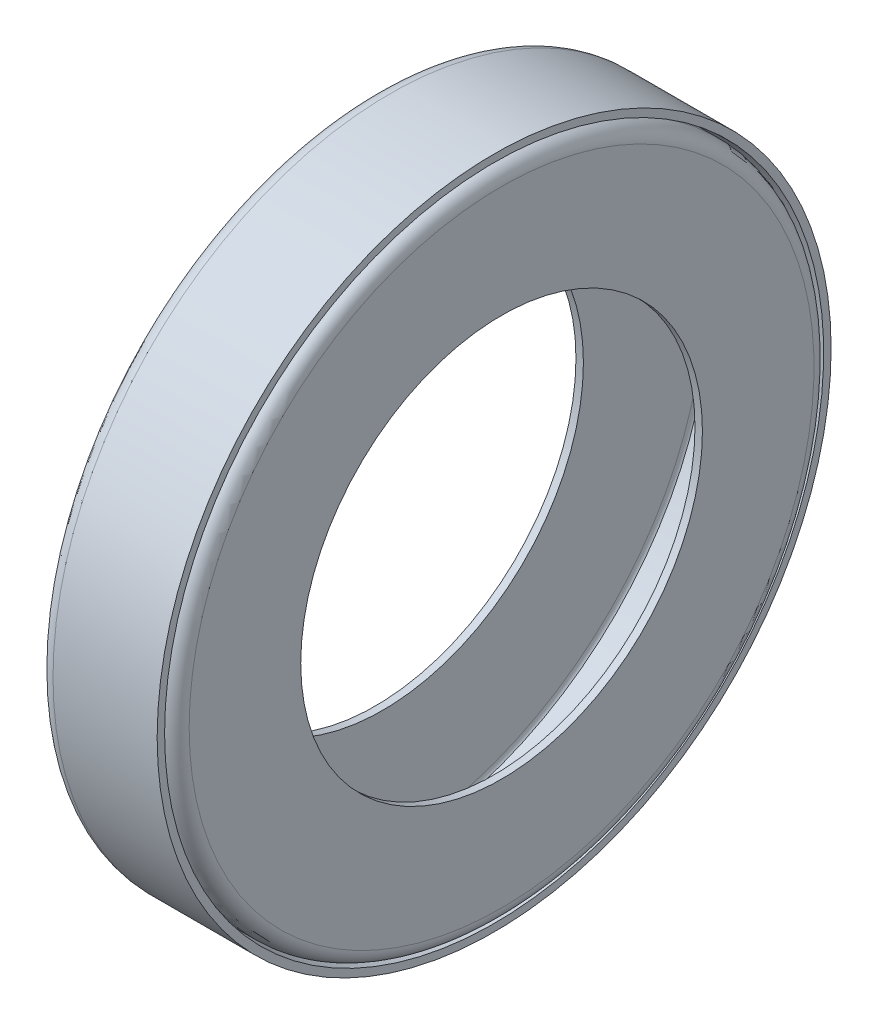
ISO-10303-21;
HEADER;
FILE_DESCRIPTION(('STEP AP214'),'2;1');
FILE_NAME('part.step','',(''),(''),'','','');
FILE_SCHEMA(('AUTOMOTIVE_DESIGN { 1 0 10303 214 1 1 1 1 }'));
ENDSEC;
DATA;
#1=APPLICATION_CONTEXT('core data for automotive mechanical design processes');
#2=APPLICATION_PROTOCOL_DEFINITION('international standard','automotive_design',2000,#1);
#3=PRODUCT_CONTEXT('',#1,'mechanical');
#4=PRODUCT('Part','Part','',(#3));
#5=PRODUCT_RELATED_PRODUCT_CATEGORY('part','',(#4));
#6=PRODUCT_DEFINITION_FORMATION('','',#4);
#7=PRODUCT_DEFINITION_CONTEXT('part definition',#1,'design');
#8=PRODUCT_DEFINITION('design','',#6,#7);
#9=PRODUCT_DEFINITION_SHAPE('','',#8);
#10=(LENGTH_UNIT() NAMED_UNIT(*) SI_UNIT(.MILLI.,.METRE.));
#11=(NAMED_UNIT(*) PLANE_ANGLE_UNIT() SI_UNIT($,.RADIAN.));
#12=(NAMED_UNIT(*) SI_UNIT($,.STERADIAN.) SOLID_ANGLE_UNIT());
#13=UNCERTAINTY_MEASURE_WITH_UNIT(LENGTH_MEASURE(1.E-05),#10,'distance_accuracy_value','');
#14=(GEOMETRIC_REPRESENTATION_CONTEXT(3) GLOBAL_UNCERTAINTY_ASSIGNED_CONTEXT((#13)) GLOBAL_UNIT_ASSIGNED_CONTEXT((#10,
#11,#12)) REPRESENTATION_CONTEXT('',''));
#15=CARTESIAN_POINT('',(0.,0.,0.));
#16=DIRECTION('',(0.,0.,1.));
#17=DIRECTION('',(1.,0.,0.));
#18=AXIS2_PLACEMENT_3D('',#15,#16,#17);
#19=CARTESIAN_POINT('',(-12.2552186006477,0.,0.));
#20=DIRECTION('',(-1.,0.,0.));
#21=DIRECTION('',(0.,0.,1.));
#22=AXIS2_PLACEMENT_3D('',#19,#20,#21);
#23=CYLINDRICAL_SURFACE('',#22,27.);
#24=CARTESIAN_POINT('',(17.,0.,0.));
#25=DIRECTION('',(-1.,0.,0.));
#26=DIRECTION('',(0.,0.,1.));
#27=AXIS2_PLACEMENT_3D('',#24,#25,#26);
#28=CIRCLE('',#27,27.);
#29=CARTESIAN_POINT('',(17.,0.,27.));
#30=VERTEX_POINT('',#29);
#31=EDGE_CURVE('E59',#30,#30,#28,.T.);
#32=ORIENTED_EDGE('',*,*,#31,.F.);
#33=EDGE_LOOP('',(#32));
#34=FACE_BOUND('',#33,.T.);
#35=CARTESIAN_POINT('',(16.,0.,0.));
#36=DIRECTION('',(-1.,0.,0.));
#37=DIRECTION('',(0.,0.,1.));
#38=AXIS2_PLACEMENT_3D('',#35,#36,#37);
#39=CIRCLE('',#38,27.);
#40=CARTESIAN_POINT('',(16.,0.,27.));
#41=VERTEX_POINT('',#40);
#42=EDGE_CURVE('E68',#41,#41,#39,.T.);
#43=ORIENTED_EDGE('',*,*,#42,.T.);
#44=EDGE_LOOP('',(#43));
#45=FACE_BOUND('',#44,.T.);
#46=ADVANCED_FACE('F39',(#34,#45),#23,.F.);
#47=CARTESIAN_POINT('',(17.,27.,0.));
#48=DIRECTION('',(-1.,0.,0.));
#49=DIRECTION('',(0.,0.,1.));
#50=AXIS2_PLACEMENT_3D('',#47,#48,#49);
#51=PLANE('',#50);
#52=CARTESIAN_POINT('',(17.,0.,0.));
#53=DIRECTION('',(-1.,0.,0.));
#54=DIRECTION('',(0.,0.,1.));
#55=AXIS2_PLACEMENT_3D('',#52,#53,#54);
#56=CIRCLE('',#55,42.);
#57=CARTESIAN_POINT('',(17.,0.,42.));
#58=VERTEX_POINT('',#57);
#59=EDGE_CURVE('E11',#58,#58,#56,.F.);
#60=ORIENTED_EDGE('',*,*,#59,.T.);
#61=EDGE_LOOP('',(#60));
#62=FACE_BOUND('',#61,.T.);
#63=ORIENTED_EDGE('',*,*,#31,.T.);
#64=EDGE_LOOP('',(#63));
#65=FACE_BOUND('',#64,.T.);
#66=ADVANCED_FACE('F88',(#62,#65),#51,.F.);
#67=CARTESIAN_POINT('',(-12.2552186006477,0.,0.));
#68=DIRECTION('',(-1.,0.,0.));
#69=DIRECTION('',(0.,0.,1.));
#70=AXIS2_PLACEMENT_3D('',#67,#68,#69);
#71=CYLINDRICAL_SURFACE('',#70,44.);
#72=CARTESIAN_POINT('',(15.,0.,0.));
#73=DIRECTION('',(-1.,0.,0.));
#74=DIRECTION('',(0.,0.,1.));
#75=AXIS2_PLACEMENT_3D('',#72,#73,#74);
#76=CIRCLE('',#75,44.);
#77=CARTESIAN_POINT('',(15.,0.,44.));
#78=VERTEX_POINT('',#77);
#79=EDGE_CURVE('E46',#78,#78,#76,.T.);
#80=ORIENTED_EDGE('',*,*,#79,.T.);
#81=EDGE_LOOP('',(#80));
#82=FACE_BOUND('',#81,.T.);
#83=CARTESIAN_POINT('',(2.,0.,0.));
#84=DIRECTION('',(-1.,0.,0.));
#85=DIRECTION('',(0.,0.,1.));
#86=AXIS2_PLACEMENT_3D('',#83,#84,#85);
#87=CIRCLE('',#86,44.);
#88=CARTESIAN_POINT('',(2.,0.,44.));
#89=VERTEX_POINT('',#88);
#90=EDGE_CURVE('E62',#89,#89,#87,.T.);
#91=ORIENTED_EDGE('',*,*,#90,.F.);
#92=EDGE_LOOP('',(#91));
#93=FACE_BOUND('',#92,.T.);
#94=ADVANCED_FACE('F94',(#82,#93),#71,.T.);
#95=CARTESIAN_POINT('',(2.,44.,0.));
#96=DIRECTION('',(1.,0.,0.));
#97=DIRECTION('',(0.,0.,-1.));
#98=AXIS2_PLACEMENT_3D('',#95,#96,#97);
#99=PLANE('',#98);
#100=CARTESIAN_POINT('',(2.,0.,0.));
#101=DIRECTION('',(-1.,0.,0.));
#102=DIRECTION('',(0.,0.,1.));
#103=AXIS2_PLACEMENT_3D('',#100,#101,#102);
#104=CIRCLE('',#103,43.);
#105=CARTESIAN_POINT('',(2.,0.,43.));
#106=VERTEX_POINT('',#105);
#107=EDGE_CURVE('E65',#106,#106,#104,.T.);
#108=ORIENTED_EDGE('',*,*,#107,.F.);
#109=EDGE_LOOP('',(#108));
#110=FACE_BOUND('',#109,.T.);
#111=ORIENTED_EDGE('',*,*,#90,.T.);
#112=EDGE_LOOP('',(#111));
#113=FACE_BOUND('',#112,.T.);
#114=ADVANCED_FACE('F84',(#110,#113),#99,.F.);
#115=CARTESIAN_POINT('',(-12.2552186006477,0.,0.));
#116=DIRECTION('',(-1.,0.,0.));
#117=DIRECTION('',(0.,0.,1.));
#118=AXIS2_PLACEMENT_3D('',#115,#116,#117);
#119=CYLINDRICAL_SURFACE('',#118,43.);
#120=CARTESIAN_POINT('',(15.,0.,0.));
#121=DIRECTION('',(1.,0.,0.));
#122=DIRECTION('',(0.,0.,-1.));
#123=AXIS2_PLACEMENT_3D('',#120,#121,#122);
#124=CIRCLE('',#123,43.);
#125=CARTESIAN_POINT('',(15.,0.,-43.));
#126=VERTEX_POINT('',#125);
#127=EDGE_CURVE('E50',#126,#126,#124,.T.);
#128=ORIENTED_EDGE('',*,*,#127,.T.);
#129=EDGE_LOOP('',(#128));
#130=FACE_BOUND('',#129,.T.);
#131=ORIENTED_EDGE('',*,*,#107,.T.);
#132=EDGE_LOOP('',(#131));
#133=FACE_BOUND('',#132,.T.);
#134=ADVANCED_FACE('F76',(#130,#133),#119,.F.);
#135=CARTESIAN_POINT('',(16.,43.,0.));
#136=DIRECTION('',(1.,0.,0.));
#137=DIRECTION('',(0.,0.,-1.));
#138=AXIS2_PLACEMENT_3D('',#135,#136,#137);
#139=PLANE('',#138);
#140=CARTESIAN_POINT('',(16.,0.,0.));
#141=DIRECTION('',(1.,0.,0.));
#142=DIRECTION('',(0.,0.,-1.));
#143=AXIS2_PLACEMENT_3D('',#140,#141,#142);
#144=CIRCLE('',#143,42.);
#145=CARTESIAN_POINT('',(16.,0.,-42.));
#146=VERTEX_POINT('',#145);
#147=EDGE_CURVE('E54',#146,#146,#144,.F.);
#148=ORIENTED_EDGE('',*,*,#147,.T.);
#149=EDGE_LOOP('',(#148));
#150=FACE_BOUND('',#149,.T.);
#151=ORIENTED_EDGE('',*,*,#42,.F.);
#152=EDGE_LOOP('',(#151));
#153=FACE_BOUND('',#152,.T.);
#154=ADVANCED_FACE('F73',(#150,#153),#139,.F.);
#155=CARTESIAN_POINT('',(15.,0.,0.));
#156=DIRECTION('',(1.,0.,0.));
#157=DIRECTION('',(0.,0.,-1.));
#158=AXIS2_PLACEMENT_3D('',#155,#156,#157);
#159=TOROIDAL_SURFACE('',#158,42.,1.);
#160=ORIENTED_EDGE('',*,*,#127,.F.);
#161=EDGE_LOOP('',(#160));
#162=FACE_BOUND('',#161,.T.);
#163=ORIENTED_EDGE('',*,*,#147,.F.);
#164=EDGE_LOOP('',(#163));
#165=FACE_BOUND('',#164,.T.);
#166=ADVANCED_FACE('F75',(#162,#165),#159,.F.);
#167=CARTESIAN_POINT('',(15.,0.,0.));
#168=DIRECTION('',(-1.,0.,0.));
#169=DIRECTION('',(0.,0.,1.));
#170=AXIS2_PLACEMENT_3D('',#167,#168,#169);
#171=TOROIDAL_SURFACE('',#170,42.,2.);
#172=ORIENTED_EDGE('',*,*,#59,.F.);
#173=EDGE_LOOP('',(#172));
#174=FACE_BOUND('',#173,.T.);
#175=ORIENTED_EDGE('',*,*,#79,.F.);
#176=EDGE_LOOP('',(#175));
#177=FACE_BOUND('',#176,.T.);
#178=ADVANCED_FACE('F41',(#174,#177),#171,.T.);
#179=CLOSED_SHELL('',(#46,#66,#94,#114,#134,#154,#166,#178));
#180=MANIFOLD_SOLID_BREP('B2',#179);
#181=CARTESIAN_POINT('',(-12.2552186006477,0.,0.));
#182=DIRECTION('',(-1.,0.,0.));
#183=DIRECTION('',(0.,0.,1.));
#184=AXIS2_PLACEMENT_3D('',#181,#182,#183);
#185=CYLINDRICAL_SURFACE('',#184,27.);
#186=CARTESIAN_POINT('',(1.,0.,0.));
#187=DIRECTION('',(-1.,0.,0.));
#188=DIRECTION('',(0.,0.,1.));
#189=AXIS2_PLACEMENT_3D('',#186,#187,#188);
#190=CIRCLE('',#189,27.);
#191=CARTESIAN_POINT('',(1.,0.,27.));
#192=VERTEX_POINT('',#191);
#193=EDGE_CURVE('E190',#192,#192,#190,.T.);
#194=ORIENTED_EDGE('',*,*,#193,.F.);
#195=EDGE_LOOP('',(#194));
#196=FACE_BOUND('',#195,.T.);
#197=CARTESIAN_POINT('',(0.,0.,0.));
#198=DIRECTION('',(-1.,0.,0.));
#199=DIRECTION('',(0.,0.,1.));
#200=AXIS2_PLACEMENT_3D('',#197,#198,#199);
#201=CIRCLE('',#200,27.);
#202=CARTESIAN_POINT('',(0.,0.,27.));
#203=VERTEX_POINT('',#202);
#204=EDGE_CURVE('E181',#203,#203,#201,.T.);
#205=ORIENTED_EDGE('',*,*,#204,.T.);
#206=EDGE_LOOP('',(#205));
#207=FACE_BOUND('',#206,.T.);
#208=ADVANCED_FACE('F161',(#196,#207),#185,.F.);
#209=CARTESIAN_POINT('',(0.,27.,0.));
#210=DIRECTION('',(1.,0.,0.));
#211=DIRECTION('',(0.,0.,-1.));
#212=AXIS2_PLACEMENT_3D('',#209,#210,#211);
#213=PLANE('',#212);
#214=CARTESIAN_POINT('',(0.,0.,0.));
#215=DIRECTION('',(1.,0.,0.));
#216=DIRECTION('',(0.,0.,-1.));
#217=AXIS2_PLACEMENT_3D('',#214,#215,#216);
#218=CIRCLE('',#217,43.3);
#219=CARTESIAN_POINT('',(0.,0.,-43.3));
#220=VERTEX_POINT('',#219);
#221=EDGE_CURVE('E168',#220,#220,#218,.F.);
#222=ORIENTED_EDGE('',*,*,#221,.T.);
#223=EDGE_LOOP('',(#222));
#224=FACE_BOUND('',#223,.T.);
#225=ORIENTED_EDGE('',*,*,#204,.F.);
#226=EDGE_LOOP('',(#225));
#227=FACE_BOUND('',#226,.T.);
#228=ADVANCED_FACE('F198',(#224,#227),#213,.F.);
#229=CARTESIAN_POINT('',(-12.2552186006477,0.,0.));
#230=DIRECTION('',(-1.,0.,0.));
#231=DIRECTION('',(0.,0.,1.));
#232=AXIS2_PLACEMENT_3D('',#229,#230,#231);
#233=CYLINDRICAL_SURFACE('',#232,45.3);
#234=CARTESIAN_POINT('',(2.,0.,0.));
#235=DIRECTION('',(1.,0.,0.));
#236=DIRECTION('',(0.,0.,-1.));
#237=AXIS2_PLACEMENT_3D('',#234,#235,#236);
#238=CIRCLE('',#237,45.3);
#239=CARTESIAN_POINT('',(2.,0.,-45.3));
#240=VERTEX_POINT('',#239);
#241=EDGE_CURVE('E38',#240,#240,#238,.T.);
#242=ORIENTED_EDGE('',*,*,#241,.T.);
#243=EDGE_LOOP('',(#242));
#244=FACE_BOUND('',#243,.T.);
#245=CARTESIAN_POINT('',(16.,0.,0.));
#246=DIRECTION('',(-1.,0.,0.));
#247=DIRECTION('',(0.,0.,1.));
#248=AXIS2_PLACEMENT_3D('',#245,#246,#247);
#249=CIRCLE('',#248,45.3);
#250=CARTESIAN_POINT('',(16.,0.,45.3));
#251=VERTEX_POINT('',#250);
#252=EDGE_CURVE('E184',#251,#251,#249,.T.);
#253=ORIENTED_EDGE('',*,*,#252,.T.);
#254=EDGE_LOOP('',(#253));
#255=FACE_BOUND('',#254,.T.);
#256=ADVANCED_FACE('F203',(#244,#255),#233,.T.);
#257=CARTESIAN_POINT('',(16.,45.3,0.));
#258=DIRECTION('',(-1.,0.,0.));
#259=DIRECTION('',(0.,0.,1.));
#260=AXIS2_PLACEMENT_3D('',#257,#258,#259);
#261=PLANE('',#260);
#262=ORIENTED_EDGE('',*,*,#252,.F.);
#263=EDGE_LOOP('',(#262));
#264=FACE_BOUND('',#263,.T.);
#265=CARTESIAN_POINT('',(16.,0.,0.));
#266=DIRECTION('',(-1.,0.,0.));
#267=DIRECTION('',(0.,0.,1.));
#268=AXIS2_PLACEMENT_3D('',#265,#266,#267);
#269=CIRCLE('',#268,44.3);
#270=CARTESIAN_POINT('',(16.,0.,44.3));
#271=VERTEX_POINT('',#270);
#272=EDGE_CURVE('E187',#271,#271,#269,.T.);
#273=ORIENTED_EDGE('',*,*,#272,.T.);
#274=EDGE_LOOP('',(#273));
#275=FACE_BOUND('',#274,.T.);
#276=ADVANCED_FACE('F208',(#264,#275),#261,.F.);
#277=CARTESIAN_POINT('',(-12.2552186006477,0.,0.));
#278=DIRECTION('',(-1.,0.,0.));
#279=DIRECTION('',(0.,0.,1.));
#280=AXIS2_PLACEMENT_3D('',#277,#278,#279);
#281=CYLINDRICAL_SURFACE('',#280,44.3);
#282=CARTESIAN_POINT('',(2.,0.,0.));
#283=DIRECTION('',(-1.,0.,0.));
#284=DIRECTION('',(0.,0.,1.));
#285=AXIS2_PLACEMENT_3D('',#282,#283,#284);
#286=CIRCLE('',#285,44.3);
#287=CARTESIAN_POINT('',(2.,0.,44.3));
#288=VERTEX_POINT('',#287);
#289=EDGE_CURVE('E176',#288,#288,#286,.T.);
#290=ORIENTED_EDGE('',*,*,#289,.T.);
#291=EDGE_LOOP('',(#290));
#292=FACE_BOUND('',#291,.T.);
#293=ORIENTED_EDGE('',*,*,#272,.F.);
#294=EDGE_LOOP('',(#293));
#295=FACE_BOUND('',#294,.T.);
#296=ADVANCED_FACE('F219',(#292,#295),#281,.F.);
#297=CARTESIAN_POINT('',(1.,44.3,0.));
#298=DIRECTION('',(-1.,0.,0.));
#299=DIRECTION('',(0.,0.,1.));
#300=AXIS2_PLACEMENT_3D('',#297,#298,#299);
#301=PLANE('',#300);
#302=CARTESIAN_POINT('',(1.,0.,0.));
#303=DIRECTION('',(-1.,0.,0.));
#304=DIRECTION('',(0.,0.,1.));
#305=AXIS2_PLACEMENT_3D('',#302,#303,#304);
#306=CIRCLE('',#305,43.3);
#307=CARTESIAN_POINT('',(1.,0.,43.3));
#308=VERTEX_POINT('',#307);
#309=EDGE_CURVE('E172',#308,#308,#306,.F.);
#310=ORIENTED_EDGE('',*,*,#309,.T.);
#311=EDGE_LOOP('',(#310));
#312=FACE_BOUND('',#311,.T.);
#313=ORIENTED_EDGE('',*,*,#193,.T.);
#314=EDGE_LOOP('',(#313));
#315=FACE_BOUND('',#314,.T.);
#316=ADVANCED_FACE('F194',(#312,#315),#301,.F.);
#317=CARTESIAN_POINT('',(2.,0.,0.));
#318=DIRECTION('',(-1.,0.,0.));
#319=DIRECTION('',(0.,0.,1.));
#320=AXIS2_PLACEMENT_3D('',#317,#318,#319);
#321=TOROIDAL_SURFACE('',#320,43.3,1.);
#322=ORIENTED_EDGE('',*,*,#309,.F.);
#323=EDGE_LOOP('',(#322));
#324=FACE_BOUND('',#323,.T.);
#325=ORIENTED_EDGE('',*,*,#289,.F.);
#326=EDGE_LOOP('',(#325));
#327=FACE_BOUND('',#326,.T.);
#328=ADVANCED_FACE('F211',(#324,#327),#321,.F.);
#329=CARTESIAN_POINT('',(2.,0.,0.));
#330=DIRECTION('',(1.,0.,0.));
#331=DIRECTION('',(0.,0.,-1.));
#332=AXIS2_PLACEMENT_3D('',#329,#330,#331);
#333=TOROIDAL_SURFACE('',#332,43.3,2.);
#334=ORIENTED_EDGE('',*,*,#241,.F.);
#335=EDGE_LOOP('',(#334));
#336=FACE_BOUND('',#335,.T.);
#337=ORIENTED_EDGE('',*,*,#221,.F.);
#338=EDGE_LOOP('',(#337));
#339=FACE_BOUND('',#338,.T.);
#340=ADVANCED_FACE('F163',(#336,#339),#333,.T.);
#341=CLOSED_SHELL('',(#208,#228,#256,#276,#296,#316,#328,#340));
#342=MANIFOLD_SOLID_BREP('B6',#341);
#343=ADVANCED_BREP_SHAPE_REPRESENTATION('',(#18,#180,#342),#14);
#344=SHAPE_DEFINITION_REPRESENTATION(#9,#343);
ENDSEC;
END-ISO-10303-21;
